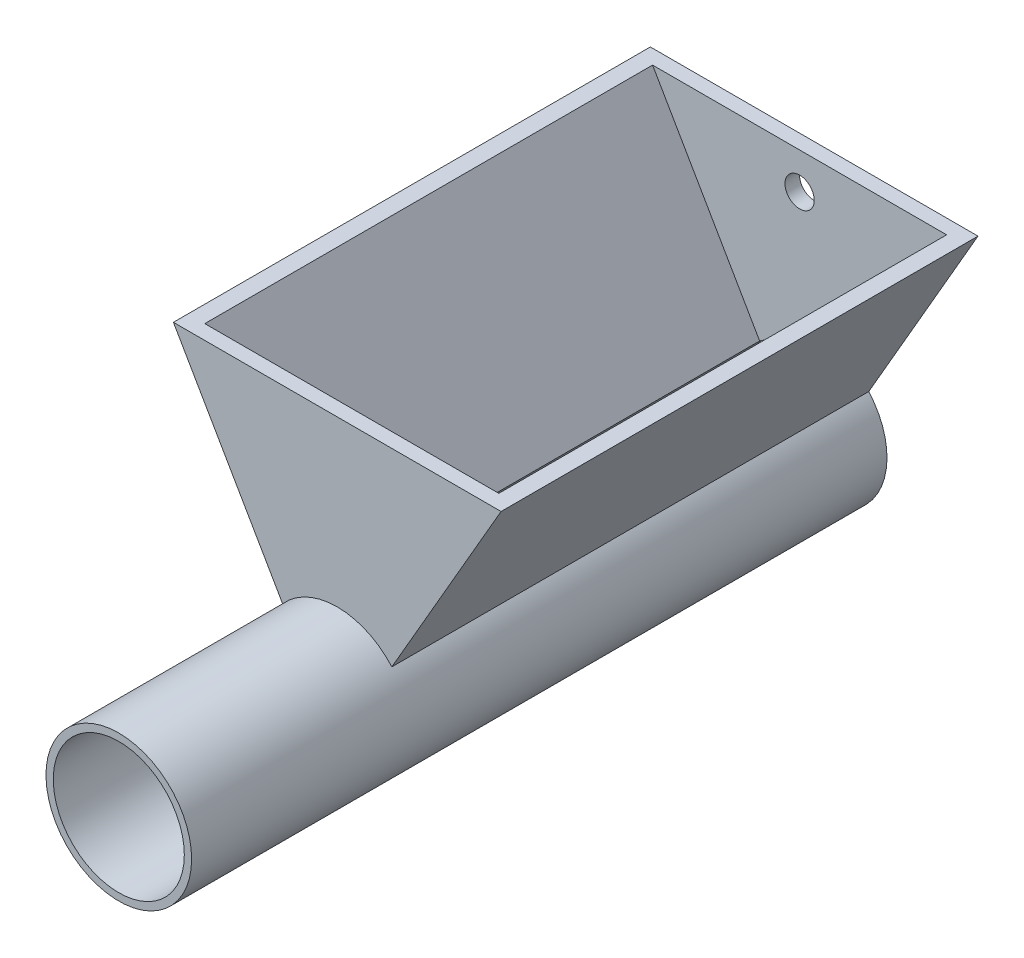
ISO-10303-21;
HEADER;
FILE_DESCRIPTION(('STEP AP214'),'2;1');
FILE_NAME('part.step','',(''),(''),'','','');
FILE_SCHEMA(('AUTOMOTIVE_DESIGN { 1 0 10303 214 1 1 1 1 }'));
ENDSEC;
DATA;
#1=APPLICATION_CONTEXT('core data for automotive mechanical design processes');
#2=APPLICATION_PROTOCOL_DEFINITION('international standard','automotive_design',2000,#1);
#3=PRODUCT_CONTEXT('',#1,'mechanical');
#4=PRODUCT('Part','Part','',(#3));
#5=PRODUCT_RELATED_PRODUCT_CATEGORY('part','',(#4));
#6=PRODUCT_DEFINITION_FORMATION('','',#4);
#7=PRODUCT_DEFINITION_CONTEXT('part definition',#1,'design');
#8=PRODUCT_DEFINITION('design','',#6,#7);
#9=PRODUCT_DEFINITION_SHAPE('','',#8);
#10=(LENGTH_UNIT() NAMED_UNIT(*) SI_UNIT(.MILLI.,.METRE.));
#11=(NAMED_UNIT(*) PLANE_ANGLE_UNIT() SI_UNIT($,.RADIAN.));
#12=(NAMED_UNIT(*) SI_UNIT($,.STERADIAN.) SOLID_ANGLE_UNIT());
#13=UNCERTAINTY_MEASURE_WITH_UNIT(LENGTH_MEASURE(1.E-05),#10,'distance_accuracy_value','');
#14=(GEOMETRIC_REPRESENTATION_CONTEXT(3) GLOBAL_UNCERTAINTY_ASSIGNED_CONTEXT((#13)) GLOBAL_UNIT_ASSIGNED_CONTEXT((#10,
#11,#12)) REPRESENTATION_CONTEXT('',''));
#15=CARTESIAN_POINT('',(0.,0.,0.));
#16=DIRECTION('',(0.,0.,1.));
#17=DIRECTION('',(1.,0.,0.));
#18=AXIS2_PLACEMENT_3D('',#15,#16,#17);
#19=CARTESIAN_POINT('',(0.,0.,-41.5925));
#20=DIRECTION('',(0.,0.,1.));
#21=DIRECTION('',(1.,0.,0.));
#22=AXIS2_PLACEMENT_3D('',#19,#20,#21);
#23=PLANE('',#22);
#24=CARTESIAN_POINT('',(0.,0.,-41.5925));
#25=DIRECTION('',(0.,0.,1.));
#26=DIRECTION('',(1.,0.,0.));
#27=AXIS2_PLACEMENT_3D('',#24,#25,#26);
#28=CIRCLE('',#27,11.43);
#29=CARTESIAN_POINT('',(11.43,0.,-41.5925));
#30=VERTEX_POINT('',#29);
#31=EDGE_CURVE('E204',#30,#30,#28,.T.);
#32=ORIENTED_EDGE('',*,*,#31,.T.);
#33=EDGE_LOOP('',(#32));
#34=FACE_BOUND('',#33,.T.);
#35=CARTESIAN_POINT('',(0.,0.,-41.5925));
#36=DIRECTION('',(0.,0.,1.));
#37=DIRECTION('',(1.,0.,0.));
#38=AXIS2_PLACEMENT_3D('',#35,#36,#37);
#39=CIRCLE('',#38,12.7);
#40=CARTESIAN_POINT('',(-9.525,8.40026041263008,-41.5925));
#41=VERTEX_POINT('',#40);
#42=CARTESIAN_POINT('',(9.525,8.40026041263008,-41.5925));
#43=VERTEX_POINT('',#42);
#44=EDGE_CURVE('E226',#41,#43,#39,.T.);
#45=ORIENTED_EDGE('',*,*,#44,.F.);
#46=DIRECTION('',(0.500000000000004,-0.866025403784436,0.));
#47=VECTOR('',#46,1.);
#48=CARTESIAN_POINT('',(-28.5750000000002,41.3958282968171,-41.5925));
#49=LINE('',#48,#47);
#50=CARTESIAN_POINT('',(-28.5750000000002,41.3958282968171,-41.5925));
#51=VERTEX_POINT('',#50);
#52=EDGE_CURVE('E235',#51,#41,#49,.T.);
#53=ORIENTED_EDGE('',*,*,#52,.F.);
#54=DIRECTION('',(-1.,0.,0.));
#55=VECTOR('',#54,1.);
#56=CARTESIAN_POINT('',(28.5750000000002,41.3958282968171,-41.5925));
#57=LINE('',#56,#55);
#58=CARTESIAN_POINT('',(28.5750000000002,41.3958282968171,-41.5925));
#59=VERTEX_POINT('',#58);
#60=EDGE_CURVE('E244',#59,#51,#57,.T.);
#61=ORIENTED_EDGE('',*,*,#60,.F.);
#62=DIRECTION('',(0.500000000000004,0.866025403784436,0.));
#63=VECTOR('',#62,1.);
#64=CARTESIAN_POINT('',(9.525,8.40026041263008,-41.5925));
#65=LINE('',#64,#63);
#66=EDGE_CURVE('E242',#43,#59,#65,.T.);
#67=ORIENTED_EDGE('',*,*,#66,.F.);
#68=EDGE_LOOP('',(#45,#53,#61,#67));
#69=FACE_BOUND('',#68,.T.);
#70=CARTESIAN_POINT('',(0.,35.0458282968171,-41.5925));
#71=DIRECTION('',(0.,0.,-1.));
#72=DIRECTION('',(-1.,0.,0.));
#73=AXIS2_PLACEMENT_3D('',#70,#71,#72);
#74=CIRCLE('',#73,2.5527);
#75=CARTESIAN_POINT('',(-2.5527,35.0458282968171,-41.5925));
#76=VERTEX_POINT('',#75);
#77=EDGE_CURVE('E296',#76,#76,#74,.T.);
#78=ORIENTED_EDGE('',*,*,#77,.F.);
#79=EDGE_LOOP('',(#78));
#80=FACE_BOUND('',#79,.T.);
#81=ADVANCED_FACE('F133',(#34,#69,#80),#23,.F.);
#82=CARTESIAN_POINT('',(28.5750000000002,41.3958282968171,41.5925));
#83=DIRECTION('',(0.,-1.,0.));
#84=DIRECTION('',(0.,0.,-1.));
#85=AXIS2_PLACEMENT_3D('',#82,#83,#84);
#86=PLANE('',#85);
#87=ORIENTED_EDGE('',*,*,#60,.T.);
#88=DIRECTION('',(0.,0.,-1.));
#89=VECTOR('',#88,1.);
#90=CARTESIAN_POINT('',(-28.5750000000002,41.3958282968171,41.5925));
#91=LINE('',#90,#89);
#92=CARTESIAN_POINT('',(-28.5750000000002,41.3958282968171,41.5925));
#93=VERTEX_POINT('',#92);
#94=EDGE_CURVE('E249',#93,#51,#91,.T.);
#95=ORIENTED_EDGE('',*,*,#94,.F.);
#96=DIRECTION('',(-1.,0.,0.));
#97=VECTOR('',#96,1.);
#98=CARTESIAN_POINT('',(28.5750000000002,41.3958282968171,41.5925));
#99=LINE('',#98,#97);
#100=CARTESIAN_POINT('',(28.5750000000002,41.3958282968171,41.5925));
#101=VERTEX_POINT('',#100);
#102=EDGE_CURVE('E234',#101,#93,#99,.T.);
#103=ORIENTED_EDGE('',*,*,#102,.F.);
#104=DIRECTION('',(0.,0.,-1.));
#105=VECTOR('',#104,1.);
#106=CARTESIAN_POINT('',(28.5750000000002,41.3958282968171,41.5925));
#107=LINE('',#106,#105);
#108=EDGE_CURVE('E141',#101,#59,#107,.T.);
#109=ORIENTED_EDGE('',*,*,#108,.T.);
#110=EDGE_LOOP('',(#87,#95,#103,#109));
#111=FACE_BOUND('',#110,.T.);
#112=DIRECTION('',(-1.,0.,0.));
#113=VECTOR('',#112,1.);
#114=CARTESIAN_POINT('',(28.5750000000002,41.3958282968171,-39.0525));
#115=LINE('',#114,#113);
#116=CARTESIAN_POINT('',(25.6420606325169,41.3958282968171,-39.0525));
#117=VERTEX_POINT('',#116);
#118=CARTESIAN_POINT('',(-25.6420606325169,41.3958282968171,-39.0525));
#119=VERTEX_POINT('',#118);
#120=EDGE_CURVE('E217',#117,#119,#115,.T.);
#121=ORIENTED_EDGE('',*,*,#120,.F.);
#122=DIRECTION('',(0.,0.,-1.));
#123=VECTOR('',#122,1.);
#124=CARTESIAN_POINT('',(25.6420606325169,41.3958282968171,41.5925));
#125=LINE('',#124,#123);
#126=CARTESIAN_POINT('',(25.6420606325169,41.3958282968171,39.0525));
#127=VERTEX_POINT('',#126);
#128=EDGE_CURVE('E225',#127,#117,#125,.T.);
#129=ORIENTED_EDGE('',*,*,#128,.F.);
#130=DIRECTION('',(-1.,0.,0.));
#131=VECTOR('',#130,1.);
#132=CARTESIAN_POINT('',(28.5750000000002,41.3958282968171,39.0525));
#133=LINE('',#132,#131);
#134=CARTESIAN_POINT('',(-25.6420606325169,41.3958282968171,39.0525));
#135=VERTEX_POINT('',#134);
#136=EDGE_CURVE('E219',#127,#135,#133,.T.);
#137=ORIENTED_EDGE('',*,*,#136,.T.);
#138=DIRECTION('',(0.,0.,-1.));
#139=VECTOR('',#138,1.);
#140=CARTESIAN_POINT('',(-25.6420606325169,41.3958282968171,41.5925));
#141=LINE('',#140,#139);
#142=EDGE_CURVE('E227',#135,#119,#141,.T.);
#143=ORIENTED_EDGE('',*,*,#142,.T.);
#144=EDGE_LOOP('',(#121,#129,#137,#143));
#145=FACE_BOUND('',#144,.T.);
#146=ADVANCED_FACE('F256',(#111,#145),#86,.F.);
#147=CARTESIAN_POINT('',(0.,0.,41.5925));
#148=DIRECTION('',(0.,0.,-1.));
#149=DIRECTION('',(-1.,0.,0.));
#150=AXIS2_PLACEMENT_3D('',#147,#148,#149);
#151=CYLINDRICAL_SURFACE('',#150,12.7);
#152=ORIENTED_EDGE('',*,*,#44,.T.);
#153=DIRECTION('',(0.,0.,-1.));
#154=VECTOR('',#153,1.);
#155=CARTESIAN_POINT('',(9.525,8.40026041263008,41.5925));
#156=LINE('',#155,#154);
#157=CARTESIAN_POINT('',(9.525,8.40026041263008,41.5925));
#158=VERTEX_POINT('',#157);
#159=EDGE_CURVE('E14',#158,#43,#156,.T.);
#160=ORIENTED_EDGE('',*,*,#159,.F.);
#161=CARTESIAN_POINT('',(0.,0.,41.5925));
#162=DIRECTION('',(0.,0.,1.));
#163=DIRECTION('',(1.,0.,0.));
#164=AXIS2_PLACEMENT_3D('',#161,#162,#163);
#165=CIRCLE('',#164,12.7);
#166=CARTESIAN_POINT('',(-9.525,8.40026041263008,41.5925));
#167=VERTEX_POINT('',#166);
#168=EDGE_CURVE('E273',#158,#167,#165,.T.);
#169=ORIENTED_EDGE('',*,*,#168,.T.);
#170=DIRECTION('',(0.,0.,-1.));
#171=VECTOR('',#170,1.);
#172=CARTESIAN_POINT('',(-9.525,8.40026041263008,41.5925));
#173=LINE('',#172,#171);
#174=EDGE_CURVE('E239',#167,#41,#173,.T.);
#175=ORIENTED_EDGE('',*,*,#174,.T.);
#176=EDGE_LOOP('',(#152,#160,#169,#175));
#177=FACE_BOUND('',#176,.T.);
#178=CARTESIAN_POINT('',(0.,0.,79.6925));
#179=DIRECTION('',(0.,0.,1.));
#180=DIRECTION('',(1.,0.,0.));
#181=AXIS2_PLACEMENT_3D('',#178,#179,#180);
#182=CIRCLE('',#181,12.7);
#183=CARTESIAN_POINT('',(12.7,0.,79.6925));
#184=VERTEX_POINT('',#183);
#185=EDGE_CURVE('E275',#184,#184,#182,.T.);
#186=ORIENTED_EDGE('',*,*,#185,.F.);
#187=EDGE_LOOP('',(#186));
#188=FACE_BOUND('',#187,.T.);
#189=ADVANCED_FACE('F135',(#177,#188),#151,.T.);
#190=CARTESIAN_POINT('',(9.525,8.40026041263008,41.5925));
#191=DIRECTION('',(-0.866025403784436,0.500000000000004,0.));
#192=DIRECTION('',(-0.500000000000004,-0.866025403784436,0.));
#193=AXIS2_PLACEMENT_3D('',#190,#191,#192);
#194=PLANE('',#193);
#195=ORIENTED_EDGE('',*,*,#66,.T.);
#196=ORIENTED_EDGE('',*,*,#108,.F.);
#197=DIRECTION('',(0.500000000000004,0.866025403784436,0.));
#198=VECTOR('',#197,1.);
#199=CARTESIAN_POINT('',(9.525,8.40026041263008,41.5925));
#200=LINE('',#199,#198);
#201=EDGE_CURVE('E232',#158,#101,#200,.T.);
#202=ORIENTED_EDGE('',*,*,#201,.F.);
#203=ORIENTED_EDGE('',*,*,#159,.T.);
#204=EDGE_LOOP('',(#195,#196,#202,#203));
#205=FACE_BOUND('',#204,.T.);
#206=ADVANCED_FACE('F314',(#205),#194,.F.);
#207=CARTESIAN_POINT('',(-28.5750000000002,41.3958282968171,41.5925));
#208=DIRECTION('',(0.866025403784436,0.500000000000004,0.));
#209=DIRECTION('',(-0.500000000000004,0.866025403784436,0.));
#210=AXIS2_PLACEMENT_3D('',#207,#208,#209);
#211=PLANE('',#210);
#212=ORIENTED_EDGE('',*,*,#52,.T.);
#213=ORIENTED_EDGE('',*,*,#174,.F.);
#214=DIRECTION('',(0.500000000000004,-0.866025403784436,0.));
#215=VECTOR('',#214,1.);
#216=CARTESIAN_POINT('',(-28.5750000000002,41.3958282968171,41.5925));
#217=LINE('',#216,#215);
#218=EDGE_CURVE('E237',#93,#167,#217,.T.);
#219=ORIENTED_EDGE('',*,*,#218,.F.);
#220=ORIENTED_EDGE('',*,*,#94,.T.);
#221=EDGE_LOOP('',(#212,#213,#219,#220));
#222=FACE_BOUND('',#221,.T.);
#223=ADVANCED_FACE('F267',(#222),#211,.F.);
#224=CARTESIAN_POINT('',(0.,0.,41.5925));
#225=DIRECTION('',(0.,0.,1.));
#226=DIRECTION('',(1.,0.,0.));
#227=AXIS2_PLACEMENT_3D('',#224,#225,#226);
#228=PLANE('',#227);
#229=ORIENTED_EDGE('',*,*,#168,.F.);
#230=ORIENTED_EDGE('',*,*,#201,.T.);
#231=ORIENTED_EDGE('',*,*,#102,.T.);
#232=ORIENTED_EDGE('',*,*,#218,.T.);
#233=EDGE_LOOP('',(#229,#230,#231,#232));
#234=FACE_BOUND('',#233,.T.);
#235=ADVANCED_FACE('F311',(#234),#228,.T.);
#236=CARTESIAN_POINT('',(7.32529547438753,9.67026041263009,41.5925));
#237=DIRECTION('',(-0.866025403784436,0.500000000000004,0.));
#238=DIRECTION('',(-0.500000000000004,-0.866025403784436,0.));
#239=AXIS2_PLACEMENT_3D('',#236,#237,#238);
#240=PLANE('',#239);
#241=DIRECTION('',(0.,0.,1.));
#242=VECTOR('',#241,1.);
#243=CARTESIAN_POINT('',(6.97161802748341,9.05767310510091,-41.5925));
#244=LINE('',#243,#242);
#245=CARTESIAN_POINT('',(6.97161802748341,9.05767310510091,39.0525));
#246=VERTEX_POINT('',#245);
#247=CARTESIAN_POINT('',(6.97161802748341,9.05767310510091,-39.0525));
#248=VERTEX_POINT('',#247);
#249=EDGE_CURVE('E148',#246,#248,#244,.F.);
#250=ORIENTED_EDGE('',*,*,#249,.F.);
#251=DIRECTION('',(0.500000000000004,0.866025403784436,0.));
#252=VECTOR('',#251,1.);
#253=CARTESIAN_POINT('',(7.32529547438753,9.67026041263009,39.0525));
#254=LINE('',#253,#252);
#255=EDGE_CURVE('E155',#246,#127,#254,.T.);
#256=ORIENTED_EDGE('',*,*,#255,.T.);
#257=ORIENTED_EDGE('',*,*,#128,.T.);
#258=DIRECTION('',(0.500000000000004,0.866025403784436,0.));
#259=VECTOR('',#258,1.);
#260=CARTESIAN_POINT('',(7.32529547438753,9.67026041263009,-39.0525));
#261=LINE('',#260,#259);
#262=EDGE_CURVE('E221',#248,#117,#261,.T.);
#263=ORIENTED_EDGE('',*,*,#262,.F.);
#264=EDGE_LOOP('',(#250,#256,#257,#263));
#265=FACE_BOUND('',#264,.T.);
#266=ADVANCED_FACE('F283',(#265),#240,.T.);
#267=CARTESIAN_POINT('',(-26.3752954743877,42.6658282968171,41.5925));
#268=DIRECTION('',(0.866025403784436,0.500000000000004,0.));
#269=DIRECTION('',(-0.500000000000004,0.866025403784436,0.));
#270=AXIS2_PLACEMENT_3D('',#267,#268,#269);
#271=PLANE('',#270);
#272=DIRECTION('',(0.,0.,1.));
#273=VECTOR('',#272,1.);
#274=CARTESIAN_POINT('',(-6.97161802748341,9.05767310510091,-41.5925));
#275=LINE('',#274,#273);
#276=CARTESIAN_POINT('',(-6.97161802748341,9.05767310510091,-39.0525));
#277=VERTEX_POINT('',#276);
#278=CARTESIAN_POINT('',(-6.97161802748341,9.05767310510091,39.0525));
#279=VERTEX_POINT('',#278);
#280=EDGE_CURVE('E199',#277,#279,#275,.T.);
#281=ORIENTED_EDGE('',*,*,#280,.F.);
#282=DIRECTION('',(0.500000000000004,-0.866025403784436,0.));
#283=VECTOR('',#282,1.);
#284=CARTESIAN_POINT('',(-26.3752954743877,42.6658282968171,-39.0525));
#285=LINE('',#284,#283);
#286=EDGE_CURVE('E210',#119,#277,#285,.T.);
#287=ORIENTED_EDGE('',*,*,#286,.F.);
#288=ORIENTED_EDGE('',*,*,#142,.F.);
#289=DIRECTION('',(0.500000000000004,-0.866025403784436,0.));
#290=VECTOR('',#289,1.);
#291=CARTESIAN_POINT('',(-26.3752954743877,42.6658282968171,39.0525));
#292=LINE('',#291,#290);
#293=EDGE_CURVE('E213',#135,#279,#292,.T.);
#294=ORIENTED_EDGE('',*,*,#293,.T.);
#295=EDGE_LOOP('',(#281,#287,#288,#294));
#296=FACE_BOUND('',#295,.T.);
#297=ADVANCED_FACE('F209',(#296),#271,.T.);
#298=CARTESIAN_POINT('',(0.,0.,39.0525));
#299=DIRECTION('',(0.,0.,1.));
#300=DIRECTION('',(1.,0.,0.));
#301=AXIS2_PLACEMENT_3D('',#298,#299,#300);
#302=PLANE('',#301);
#303=ORIENTED_EDGE('',*,*,#255,.F.);
#304=CARTESIAN_POINT('',(0.,0.,39.0525));
#305=DIRECTION('',(0.,0.,1.));
#306=DIRECTION('',(1.,0.,0.));
#307=AXIS2_PLACEMENT_3D('',#304,#305,#306);
#308=CIRCLE('',#307,11.43);
#309=EDGE_CURVE('E276',#246,#279,#308,.T.);
#310=ORIENTED_EDGE('',*,*,#309,.T.);
#311=ORIENTED_EDGE('',*,*,#293,.F.);
#312=ORIENTED_EDGE('',*,*,#136,.F.);
#313=EDGE_LOOP('',(#303,#310,#311,#312));
#314=FACE_BOUND('',#313,.T.);
#315=ADVANCED_FACE('F285',(#314),#302,.F.);
#316=CARTESIAN_POINT('',(0.,0.,-39.0525));
#317=DIRECTION('',(0.,0.,1.));
#318=DIRECTION('',(1.,0.,0.));
#319=AXIS2_PLACEMENT_3D('',#316,#317,#318);
#320=PLANE('',#319);
#321=CARTESIAN_POINT('',(0.,35.0458282968171,-39.0525));
#322=DIRECTION('',(0.,0.,1.));
#323=DIRECTION('',(1.,0.,0.));
#324=AXIS2_PLACEMENT_3D('',#321,#322,#323);
#325=CIRCLE('',#324,2.5527);
#326=CARTESIAN_POINT('',(2.5527,35.0458282968171,-39.0525));
#327=VERTEX_POINT('',#326);
#328=EDGE_CURVE('E291',#327,#327,#325,.T.);
#329=ORIENTED_EDGE('',*,*,#328,.F.);
#330=EDGE_LOOP('',(#329));
#331=FACE_BOUND('',#330,.T.);
#332=CARTESIAN_POINT('',(0.,0.,-39.0525));
#333=DIRECTION('',(0.,0.,1.));
#334=DIRECTION('',(1.,0.,0.));
#335=AXIS2_PLACEMENT_3D('',#332,#333,#334);
#336=CIRCLE('',#335,11.43);
#337=EDGE_CURVE('E196',#248,#277,#336,.T.);
#338=ORIENTED_EDGE('',*,*,#337,.F.);
#339=ORIENTED_EDGE('',*,*,#262,.T.);
#340=ORIENTED_EDGE('',*,*,#120,.T.);
#341=ORIENTED_EDGE('',*,*,#286,.T.);
#342=EDGE_LOOP('',(#338,#339,#340,#341));
#343=FACE_BOUND('',#342,.T.);
#344=ADVANCED_FACE('F215',(#331,#343),#320,.T.);
#345=CARTESIAN_POINT('',(0.,0.,79.6925));
#346=DIRECTION('',(0.,0.,1.));
#347=DIRECTION('',(1.,0.,0.));
#348=AXIS2_PLACEMENT_3D('',#345,#346,#347);
#349=PLANE('',#348);
#350=CARTESIAN_POINT('',(0.,0.,79.6925));
#351=DIRECTION('',(0.,0.,1.));
#352=DIRECTION('',(1.,0.,0.));
#353=AXIS2_PLACEMENT_3D('',#350,#351,#352);
#354=CIRCLE('',#353,11.43);
#355=CARTESIAN_POINT('',(11.43,0.,79.6925));
#356=VERTEX_POINT('',#355);
#357=EDGE_CURVE('E288',#356,#356,#354,.T.);
#358=ORIENTED_EDGE('',*,*,#357,.F.);
#359=EDGE_LOOP('',(#358));
#360=FACE_BOUND('',#359,.T.);
#361=ORIENTED_EDGE('',*,*,#185,.T.);
#362=EDGE_LOOP('',(#361));
#363=FACE_BOUND('',#362,.T.);
#364=ADVANCED_FACE('F329',(#360,#363),#349,.T.);
#365=CARTESIAN_POINT('',(0.,0.,-41.5925));
#366=DIRECTION('',(0.,0.,1.));
#367=DIRECTION('',(1.,0.,0.));
#368=AXIS2_PLACEMENT_3D('',#365,#366,#367);
#369=CYLINDRICAL_SURFACE('',#368,11.43);
#370=ORIENTED_EDGE('',*,*,#31,.F.);
#371=EDGE_LOOP('',(#370));
#372=FACE_BOUND('',#371,.T.);
#373=ORIENTED_EDGE('',*,*,#357,.T.);
#374=EDGE_LOOP('',(#373));
#375=FACE_BOUND('',#374,.T.);
#376=ORIENTED_EDGE('',*,*,#249,.T.);
#377=ORIENTED_EDGE('',*,*,#337,.T.);
#378=ORIENTED_EDGE('',*,*,#280,.T.);
#379=ORIENTED_EDGE('',*,*,#309,.F.);
#380=EDGE_LOOP('',(#376,#377,#378,#379));
#381=FACE_BOUND('',#380,.T.);
#382=ADVANCED_FACE('F198',(#372,#375,#381),#369,.F.);
#383=CARTESIAN_POINT('',(0.,35.0458282968171,-41.5925));
#384=DIRECTION('',(0.,0.,-1.));
#385=DIRECTION('',(-1.,0.,0.));
#386=AXIS2_PLACEMENT_3D('',#383,#384,#385);
#387=CYLINDRICAL_SURFACE('',#386,2.5527);
#388=ORIENTED_EDGE('',*,*,#77,.T.);
#389=EDGE_LOOP('',(#388));
#390=FACE_BOUND('',#389,.T.);
#391=ORIENTED_EDGE('',*,*,#328,.T.);
#392=EDGE_LOOP('',(#391));
#393=FACE_BOUND('',#392,.T.);
#394=ADVANCED_FACE('F300',(#390,#393),#387,.F.);
#395=CLOSED_SHELL('',(#81,#146,#189,#206,#223,#235,#266,#297,#315,#344,#364,#382,#394));
#396=MANIFOLD_SOLID_BREP('B2',#395);
#397=ADVANCED_BREP_SHAPE_REPRESENTATION('',(#18,#396),#14);
#398=SHAPE_DEFINITION_REPRESENTATION(#9,#397);
ENDSEC;
END-ISO-10303-21;
